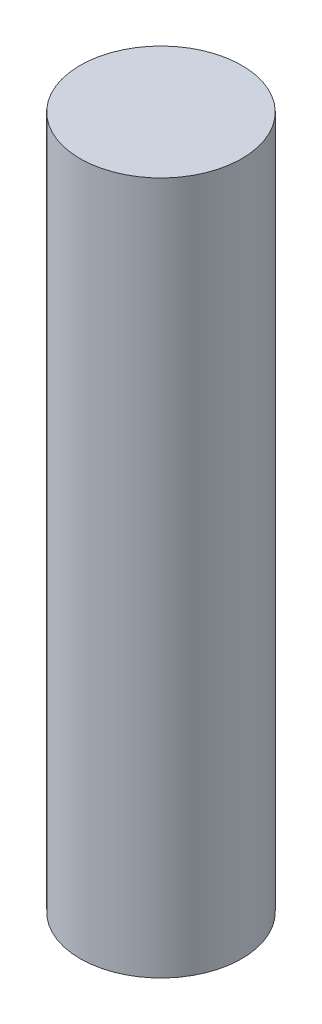
ISO-10303-21;
HEADER;
FILE_DESCRIPTION(('STEP AP214'),'2;1');
FILE_NAME('part.step','',(''),(''),'','','');
FILE_SCHEMA(('AUTOMOTIVE_DESIGN { 1 0 10303 214 1 1 1 1 }'));
ENDSEC;
DATA;
#1=APPLICATION_CONTEXT('core data for automotive mechanical design processes');
#2=APPLICATION_PROTOCOL_DEFINITION('international standard','automotive_design',2000,#1);
#3=PRODUCT_CONTEXT('',#1,'mechanical');
#4=PRODUCT('Part','Part','',(#3));
#5=PRODUCT_RELATED_PRODUCT_CATEGORY('part','',(#4));
#6=PRODUCT_DEFINITION_FORMATION('','',#4);
#7=PRODUCT_DEFINITION_CONTEXT('part definition',#1,'design');
#8=PRODUCT_DEFINITION('design','',#6,#7);
#9=PRODUCT_DEFINITION_SHAPE('','',#8);
#10=(LENGTH_UNIT() NAMED_UNIT(*) SI_UNIT(.MILLI.,.METRE.));
#11=(NAMED_UNIT(*) PLANE_ANGLE_UNIT() SI_UNIT($,.RADIAN.));
#12=(NAMED_UNIT(*) SI_UNIT($,.STERADIAN.) SOLID_ANGLE_UNIT());
#13=UNCERTAINTY_MEASURE_WITH_UNIT(LENGTH_MEASURE(1.E-05),#10,'distance_accuracy_value','');
#14=(GEOMETRIC_REPRESENTATION_CONTEXT(3) GLOBAL_UNCERTAINTY_ASSIGNED_CONTEXT((#13)) GLOBAL_UNIT_ASSIGNED_CONTEXT((#10,
#11,#12)) REPRESENTATION_CONTEXT('',''));
#15=CARTESIAN_POINT('',(0.,0.,0.));
#16=DIRECTION('',(0.,0.,1.));
#17=DIRECTION('',(1.,0.,0.));
#18=AXIS2_PLACEMENT_3D('',#15,#16,#17);
#19=CARTESIAN_POINT('',(0.,30.,0.));
#20=DIRECTION('',(0.,-1.,0.));
#21=DIRECTION('',(0.,0.,-1.));
#22=AXIS2_PLACEMENT_3D('',#19,#20,#21);
#23=CYLINDRICAL_SURFACE('',#22,3.5);
#24=CARTESIAN_POINT('',(0.,30.,0.));
#25=DIRECTION('',(0.,1.,0.));
#26=DIRECTION('',(0.,0.,1.));
#27=AXIS2_PLACEMENT_3D('',#24,#25,#26);
#28=CIRCLE('',#27,3.5);
#29=CARTESIAN_POINT('',(0.,30.,3.5));
#30=VERTEX_POINT('',#29);
#31=EDGE_CURVE('E10',#30,#30,#28,.T.);
#32=ORIENTED_EDGE('',*,*,#31,.F.);
#33=EDGE_LOOP('',(#32));
#34=FACE_BOUND('',#33,.T.);
#35=CARTESIAN_POINT('',(0.,0.,0.));
#36=DIRECTION('',(0.,1.,0.));
#37=DIRECTION('',(0.,0.,1.));
#38=AXIS2_PLACEMENT_3D('',#35,#36,#37);
#39=CIRCLE('',#38,3.5);
#40=CARTESIAN_POINT('',(0.,0.,3.5));
#41=VERTEX_POINT('',#40);
#42=EDGE_CURVE('E40',#41,#41,#39,.T.);
#43=ORIENTED_EDGE('',*,*,#42,.T.);
#44=EDGE_LOOP('',(#43));
#45=FACE_BOUND('',#44,.T.);
#46=ADVANCED_FACE('F37',(#34,#45),#23,.T.);
#47=CARTESIAN_POINT('',(0.,30.,0.));
#48=DIRECTION('',(0.,1.,0.));
#49=DIRECTION('',(0.,0.,1.));
#50=AXIS2_PLACEMENT_3D('',#47,#48,#49);
#51=PLANE('',#50);
#52=ORIENTED_EDGE('',*,*,#31,.T.);
#53=EDGE_LOOP('',(#52));
#54=FACE_BOUND('',#53,.T.);
#55=ADVANCED_FACE('F54',(#54),#51,.T.);
#56=CARTESIAN_POINT('',(0.,0.,0.));
#57=DIRECTION('',(0.,1.,0.));
#58=DIRECTION('',(0.,0.,1.));
#59=AXIS2_PLACEMENT_3D('',#56,#57,#58);
#60=PLANE('',#59);
#61=ORIENTED_EDGE('',*,*,#42,.F.);
#62=EDGE_LOOP('',(#61));
#63=FACE_BOUND('',#62,.T.);
#64=ADVANCED_FACE('F52',(#63),#60,.F.);
#65=CLOSED_SHELL('',(#46,#55,#64));
#66=MANIFOLD_SOLID_BREP('B2',#65);
#67=ADVANCED_BREP_SHAPE_REPRESENTATION('',(#18,#66),#14);
#68=SHAPE_DEFINITION_REPRESENTATION(#9,#67);
ENDSEC;
END-ISO-10303-21;
